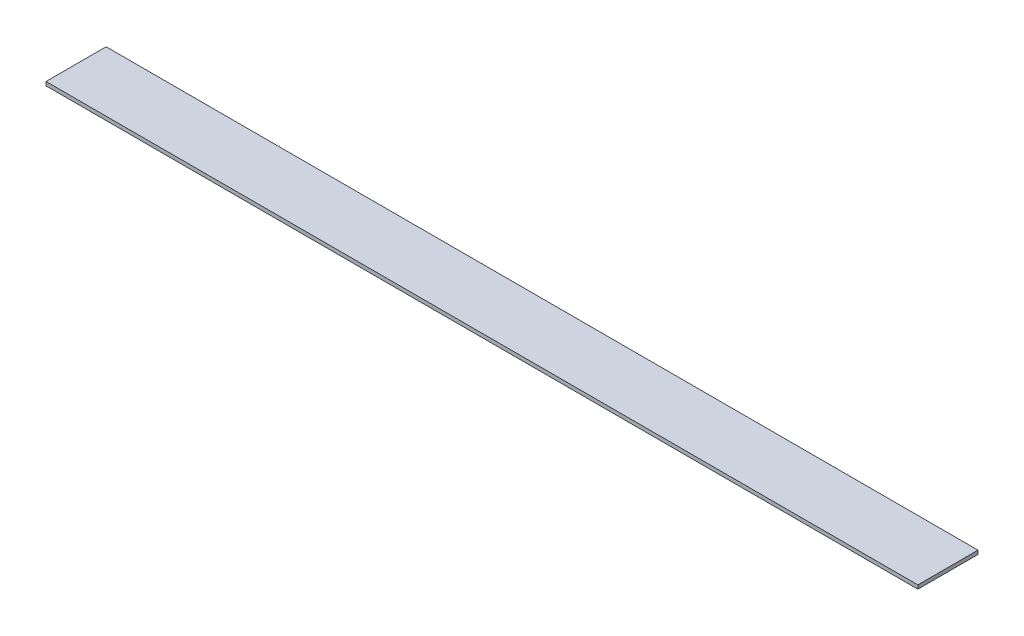
ISO-10303-21;
HEADER;
FILE_DESCRIPTION(('STEP AP214'),'2;1');
FILE_NAME('part.step','',(''),(''),'','','');
FILE_SCHEMA(('AUTOMOTIVE_DESIGN { 1 0 10303 214 1 1 1 1 }'));
ENDSEC;
DATA;
#1=APPLICATION_CONTEXT('core data for automotive mechanical design processes');
#2=APPLICATION_PROTOCOL_DEFINITION('international standard','automotive_design',2000,#1);
#3=PRODUCT_CONTEXT('',#1,'mechanical');
#4=PRODUCT('Part','Part','',(#3));
#5=PRODUCT_RELATED_PRODUCT_CATEGORY('part','',(#4));
#6=PRODUCT_DEFINITION_FORMATION('','',#4);
#7=PRODUCT_DEFINITION_CONTEXT('part definition',#1,'design');
#8=PRODUCT_DEFINITION('design','',#6,#7);
#9=PRODUCT_DEFINITION_SHAPE('','',#8);
#10=(LENGTH_UNIT() NAMED_UNIT(*) SI_UNIT(.MILLI.,.METRE.));
#11=(NAMED_UNIT(*) PLANE_ANGLE_UNIT() SI_UNIT($,.RADIAN.));
#12=(NAMED_UNIT(*) SI_UNIT($,.STERADIAN.) SOLID_ANGLE_UNIT());
#13=UNCERTAINTY_MEASURE_WITH_UNIT(LENGTH_MEASURE(1.E-05),#10,'distance_accuracy_value','');
#14=(GEOMETRIC_REPRESENTATION_CONTEXT(3) GLOBAL_UNCERTAINTY_ASSIGNED_CONTEXT((#13)) GLOBAL_UNIT_ASSIGNED_CONTEXT((#10,
#11,#12)) REPRESENTATION_CONTEXT('',''));
#15=CARTESIAN_POINT('',(0.,0.,0.));
#16=DIRECTION('',(0.,0.,1.));
#17=DIRECTION('',(1.,0.,0.));
#18=AXIS2_PLACEMENT_3D('',#15,#16,#17);
#19=CARTESIAN_POINT('',(0.,1.5875,0.));
#20=DIRECTION('',(1.,0.,0.));
#21=DIRECTION('',(0.,0.,-1.));
#22=AXIS2_PLACEMENT_3D('',#19,#20,#21);
#23=PLANE('',#22);
#24=DIRECTION('',(0.,0.,1.));
#25=VECTOR('',#24,1.);
#26=CARTESIAN_POINT('',(0.,0.,0.));
#27=LINE('',#26,#25);
#28=CARTESIAN_POINT('',(0.,0.,-25.4));
#29=VERTEX_POINT('',#28);
#30=CARTESIAN_POINT('',(0.,0.,0.));
#31=VERTEX_POINT('',#30);
#32=EDGE_CURVE('E96',#29,#31,#27,.T.);
#33=ORIENTED_EDGE('',*,*,#32,.T.);
#34=DIRECTION('',(0.,-1.,0.));
#35=VECTOR('',#34,1.);
#36=CARTESIAN_POINT('',(0.,1.5875,0.));
#37=LINE('',#36,#35);
#38=CARTESIAN_POINT('',(0.,1.5875,0.));
#39=VERTEX_POINT('',#38);
#40=EDGE_CURVE('E11',#39,#31,#37,.T.);
#41=ORIENTED_EDGE('',*,*,#40,.F.);
#42=DIRECTION('',(0.,0.,1.));
#43=VECTOR('',#42,1.);
#44=CARTESIAN_POINT('',(0.,1.5875,0.));
#45=LINE('',#44,#43);
#46=CARTESIAN_POINT('',(0.,1.5875,-25.4));
#47=VERTEX_POINT('',#46);
#48=EDGE_CURVE('E84',#47,#39,#45,.T.);
#49=ORIENTED_EDGE('',*,*,#48,.F.);
#50=DIRECTION('',(0.,-1.,0.));
#51=VECTOR('',#50,1.);
#52=CARTESIAN_POINT('',(0.,1.5875,-25.4));
#53=LINE('',#52,#51);
#54=EDGE_CURVE('E92',#47,#29,#53,.T.);
#55=ORIENTED_EDGE('',*,*,#54,.T.);
#56=EDGE_LOOP('',(#33,#41,#49,#55));
#57=FACE_BOUND('',#56,.T.);
#58=ADVANCED_FACE('F33',(#57),#23,.F.);
#59=CARTESIAN_POINT('',(0.,1.5875,0.));
#60=DIRECTION('',(0.,0.,-1.));
#61=DIRECTION('',(-1.,0.,0.));
#62=AXIS2_PLACEMENT_3D('',#59,#60,#61);
#63=PLANE('',#62);
#64=DIRECTION('',(1.,0.,0.));
#65=VECTOR('',#64,1.);
#66=CARTESIAN_POINT('',(0.,0.,0.));
#67=LINE('',#66,#65);
#68=CARTESIAN_POINT('',(368.3,0.,0.));
#69=VERTEX_POINT('',#68);
#70=EDGE_CURVE('E88',#31,#69,#67,.T.);
#71=ORIENTED_EDGE('',*,*,#70,.T.);
#72=DIRECTION('',(0.,-1.,0.));
#73=VECTOR('',#72,1.);
#74=CARTESIAN_POINT('',(368.3,1.5875,0.));
#75=LINE('',#74,#73);
#76=CARTESIAN_POINT('',(368.3,1.5875,0.));
#77=VERTEX_POINT('',#76);
#78=EDGE_CURVE('E41',#77,#69,#75,.T.);
#79=ORIENTED_EDGE('',*,*,#78,.F.);
#80=DIRECTION('',(1.,0.,0.));
#81=VECTOR('',#80,1.);
#82=CARTESIAN_POINT('',(0.,1.5875,0.));
#83=LINE('',#82,#81);
#84=EDGE_CURVE('E79',#39,#77,#83,.T.);
#85=ORIENTED_EDGE('',*,*,#84,.F.);
#86=ORIENTED_EDGE('',*,*,#40,.T.);
#87=EDGE_LOOP('',(#71,#79,#85,#86));
#88=FACE_BOUND('',#87,.T.);
#89=ADVANCED_FACE('F87',(#88),#63,.F.);
#90=CARTESIAN_POINT('',(368.3,1.5875,0.));
#91=DIRECTION('',(-1.,0.,0.));
#92=DIRECTION('',(0.,0.,1.));
#93=AXIS2_PLACEMENT_3D('',#90,#91,#92);
#94=PLANE('',#93);
#95=DIRECTION('',(0.,0.,-1.));
#96=VECTOR('',#95,1.);
#97=CARTESIAN_POINT('',(368.3,0.,0.));
#98=LINE('',#97,#96);
#99=CARTESIAN_POINT('',(368.3,0.,-25.4));
#100=VERTEX_POINT('',#99);
#101=EDGE_CURVE('E66',#69,#100,#98,.T.);
#102=ORIENTED_EDGE('',*,*,#101,.T.);
#103=DIRECTION('',(0.,-1.,0.));
#104=VECTOR('',#103,1.);
#105=CARTESIAN_POINT('',(368.3,1.5875,-25.4));
#106=LINE('',#105,#104);
#107=CARTESIAN_POINT('',(368.3,1.5875,-25.4));
#108=VERTEX_POINT('',#107);
#109=EDGE_CURVE('E89',#108,#100,#106,.T.);
#110=ORIENTED_EDGE('',*,*,#109,.F.);
#111=DIRECTION('',(0.,0.,-1.));
#112=VECTOR('',#111,1.);
#113=CARTESIAN_POINT('',(368.3,1.5875,0.));
#114=LINE('',#113,#112);
#115=EDGE_CURVE('E82',#77,#108,#114,.T.);
#116=ORIENTED_EDGE('',*,*,#115,.F.);
#117=ORIENTED_EDGE('',*,*,#78,.T.);
#118=EDGE_LOOP('',(#102,#110,#116,#117));
#119=FACE_BOUND('',#118,.T.);
#120=ADVANCED_FACE('F90',(#119),#94,.F.);
#121=CARTESIAN_POINT('',(0.,1.5875,-25.4));
#122=DIRECTION('',(0.,0.,1.));
#123=DIRECTION('',(1.,0.,0.));
#124=AXIS2_PLACEMENT_3D('',#121,#122,#123);
#125=PLANE('',#124);
#126=DIRECTION('',(-1.,0.,0.));
#127=VECTOR('',#126,1.);
#128=CARTESIAN_POINT('',(0.,0.,-25.4));
#129=LINE('',#128,#127);
#130=EDGE_CURVE('E72',#100,#29,#129,.T.);
#131=ORIENTED_EDGE('',*,*,#130,.T.);
#132=ORIENTED_EDGE('',*,*,#54,.F.);
#133=DIRECTION('',(-1.,0.,0.));
#134=VECTOR('',#133,1.);
#135=CARTESIAN_POINT('',(0.,1.5875,-25.4));
#136=LINE('',#135,#134);
#137=EDGE_CURVE('E49',#108,#47,#136,.T.);
#138=ORIENTED_EDGE('',*,*,#137,.F.);
#139=ORIENTED_EDGE('',*,*,#109,.T.);
#140=EDGE_LOOP('',(#131,#132,#138,#139));
#141=FACE_BOUND('',#140,.T.);
#142=ADVANCED_FACE('F103',(#141),#125,.F.);
#143=CARTESIAN_POINT('',(0.,1.5875,0.));
#144=DIRECTION('',(0.,-1.,0.));
#145=DIRECTION('',(0.,0.,-1.));
#146=AXIS2_PLACEMENT_3D('',#143,#144,#145);
#147=PLANE('',#146);
#148=ORIENTED_EDGE('',*,*,#48,.T.);
#149=ORIENTED_EDGE('',*,*,#84,.T.);
#150=ORIENTED_EDGE('',*,*,#115,.T.);
#151=ORIENTED_EDGE('',*,*,#137,.T.);
#152=EDGE_LOOP('',(#148,#149,#150,#151));
#153=FACE_BOUND('',#152,.T.);
#154=ADVANCED_FACE('F80',(#153),#147,.F.);
#155=CARTESIAN_POINT('',(0.,0.,0.));
#156=DIRECTION('',(0.,-1.,0.));
#157=DIRECTION('',(0.,0.,-1.));
#158=AXIS2_PLACEMENT_3D('',#155,#156,#157);
#159=PLANE('',#158);
#160=ORIENTED_EDGE('',*,*,#32,.F.);
#161=ORIENTED_EDGE('',*,*,#130,.F.);
#162=ORIENTED_EDGE('',*,*,#101,.F.);
#163=ORIENTED_EDGE('',*,*,#70,.F.);
#164=EDGE_LOOP('',(#160,#161,#162,#163));
#165=FACE_BOUND('',#164,.T.);
#166=ADVANCED_FACE('F106',(#165),#159,.T.);
#167=CLOSED_SHELL('',(#58,#89,#120,#142,#154,#166));
#168=MANIFOLD_SOLID_BREP('B2',#167);
#169=ADVANCED_BREP_SHAPE_REPRESENTATION('',(#18,#168),#14);
#170=SHAPE_DEFINITION_REPRESENTATION(#9,#169);
ENDSEC;
END-ISO-10303-21;
